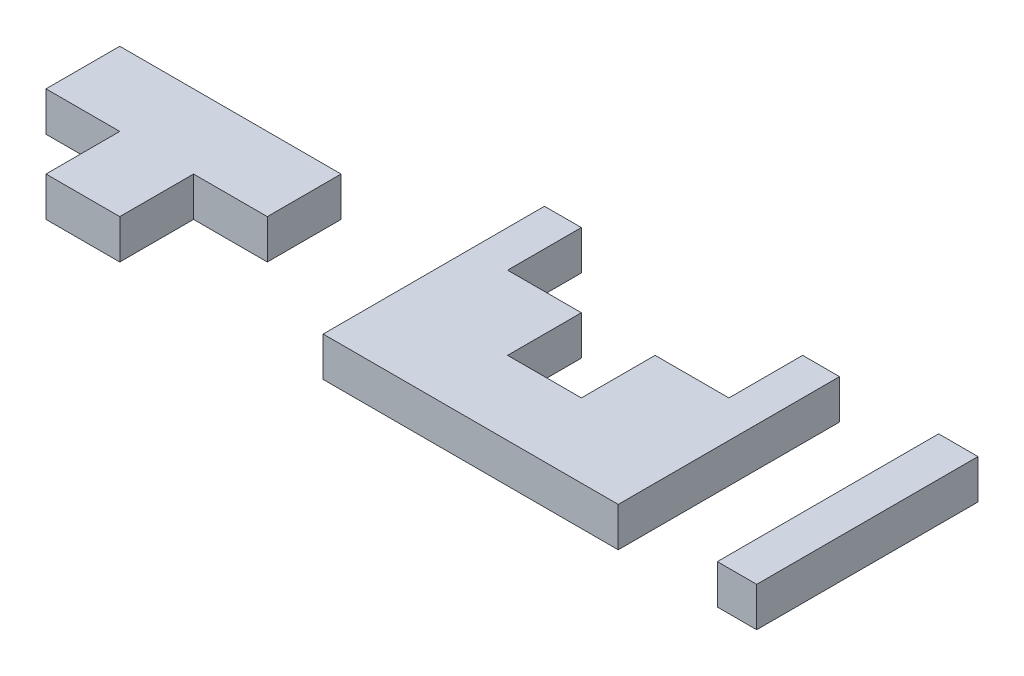
ISO-10303-21;
HEADER;
FILE_DESCRIPTION(('STEP AP214'),'2;1');
FILE_NAME('part.step','',(''),(''),'','','');
FILE_SCHEMA(('AUTOMOTIVE_DESIGN { 1 0 10303 214 1 1 1 1 }'));
ENDSEC;
DATA;
#1=APPLICATION_CONTEXT('core data for automotive mechanical design processes');
#2=APPLICATION_PROTOCOL_DEFINITION('international standard','automotive_design',2000,#1);
#3=PRODUCT_CONTEXT('',#1,'mechanical');
#4=PRODUCT('Part','Part','',(#3));
#5=PRODUCT_RELATED_PRODUCT_CATEGORY('part','',(#4));
#6=PRODUCT_DEFINITION_FORMATION('','',#4);
#7=PRODUCT_DEFINITION_CONTEXT('part definition',#1,'design');
#8=PRODUCT_DEFINITION('design','',#6,#7);
#9=PRODUCT_DEFINITION_SHAPE('','',#8);
#10=(LENGTH_UNIT() NAMED_UNIT(*) SI_UNIT(.MILLI.,.METRE.));
#11=(NAMED_UNIT(*) PLANE_ANGLE_UNIT() SI_UNIT($,.RADIAN.));
#12=(NAMED_UNIT(*) SI_UNIT($,.STERADIAN.) SOLID_ANGLE_UNIT());
#13=UNCERTAINTY_MEASURE_WITH_UNIT(LENGTH_MEASURE(1.E-05),#10,'distance_accuracy_value','');
#14=(GEOMETRIC_REPRESENTATION_CONTEXT(3) GLOBAL_UNCERTAINTY_ASSIGNED_CONTEXT((#13)) GLOBAL_UNIT_ASSIGNED_CONTEXT((#10,
#11,#12)) REPRESENTATION_CONTEXT('',''));
#15=CARTESIAN_POINT('',(0.,0.,0.));
#16=DIRECTION('',(0.,0.,1.));
#17=DIRECTION('',(1.,0.,0.));
#18=AXIS2_PLACEMENT_3D('',#15,#16,#17);
#19=CARTESIAN_POINT('',(105.177341044386,8.,-45.));
#20=DIRECTION('',(1.,0.,0.));
#21=DIRECTION('',(0.,0.,-1.));
#22=AXIS2_PLACEMENT_3D('',#19,#20,#21);
#23=PLANE('',#22);
#24=DIRECTION('',(0.,0.,1.));
#25=VECTOR('',#24,1.);
#26=CARTESIAN_POINT('',(105.177341044386,0.,-45.));
#27=LINE('',#26,#25);
#28=CARTESIAN_POINT('',(105.177341044386,0.,-45.));
#29=VERTEX_POINT('',#28);
#30=CARTESIAN_POINT('',(105.177341044386,0.,0.));
#31=VERTEX_POINT('',#30);
#32=EDGE_CURVE('E113',#29,#31,#27,.T.);
#33=ORIENTED_EDGE('',*,*,#32,.T.);
#34=DIRECTION('',(0.,-1.,0.));
#35=VECTOR('',#34,1.);
#36=CARTESIAN_POINT('',(105.177341044386,8.,0.));
#37=LINE('',#36,#35);
#38=CARTESIAN_POINT('',(105.177341044386,8.,0.));
#39=VERTEX_POINT('',#38);
#40=EDGE_CURVE('E12',#39,#31,#37,.T.);
#41=ORIENTED_EDGE('',*,*,#40,.F.);
#42=DIRECTION('',(0.,0.,1.));
#43=VECTOR('',#42,1.);
#44=CARTESIAN_POINT('',(105.177341044386,8.,-45.));
#45=LINE('',#44,#43);
#46=CARTESIAN_POINT('',(105.177341044386,8.,-45.));
#47=VERTEX_POINT('',#46);
#48=EDGE_CURVE('E101',#47,#39,#45,.T.);
#49=ORIENTED_EDGE('',*,*,#48,.F.);
#50=DIRECTION('',(0.,-1.,0.));
#51=VECTOR('',#50,1.);
#52=CARTESIAN_POINT('',(105.177341044386,8.,-45.));
#53=LINE('',#52,#51);
#54=EDGE_CURVE('E109',#47,#29,#53,.T.);
#55=ORIENTED_EDGE('',*,*,#54,.T.);
#56=EDGE_LOOP('',(#33,#41,#49,#55));
#57=FACE_BOUND('',#56,.T.);
#58=ADVANCED_FACE('F50',(#57),#23,.F.);
#59=CARTESIAN_POINT('',(105.177341044386,8.,0.));
#60=DIRECTION('',(0.,0.,-1.));
#61=DIRECTION('',(-1.,0.,0.));
#62=AXIS2_PLACEMENT_3D('',#59,#60,#61);
#63=PLANE('',#62);
#64=DIRECTION('',(1.,0.,0.));
#65=VECTOR('',#64,1.);
#66=CARTESIAN_POINT('',(105.177341044386,0.,0.));
#67=LINE('',#66,#65);
#68=CARTESIAN_POINT('',(113.177341044386,0.,0.));
#69=VERTEX_POINT('',#68);
#70=EDGE_CURVE('E105',#31,#69,#67,.T.);
#71=ORIENTED_EDGE('',*,*,#70,.T.);
#72=DIRECTION('',(0.,-1.,0.));
#73=VECTOR('',#72,1.);
#74=CARTESIAN_POINT('',(113.177341044386,8.,0.));
#75=LINE('',#74,#73);
#76=CARTESIAN_POINT('',(113.177341044386,8.,0.));
#77=VERTEX_POINT('',#76);
#78=EDGE_CURVE('E58',#77,#69,#75,.T.);
#79=ORIENTED_EDGE('',*,*,#78,.F.);
#80=DIRECTION('',(1.,0.,0.));
#81=VECTOR('',#80,1.);
#82=CARTESIAN_POINT('',(105.177341044386,8.,0.));
#83=LINE('',#82,#81);
#84=EDGE_CURVE('E96',#39,#77,#83,.T.);
#85=ORIENTED_EDGE('',*,*,#84,.F.);
#86=ORIENTED_EDGE('',*,*,#40,.T.);
#87=EDGE_LOOP('',(#71,#79,#85,#86));
#88=FACE_BOUND('',#87,.T.);
#89=ADVANCED_FACE('F104',(#88),#63,.F.);
#90=CARTESIAN_POINT('',(113.177341044386,8.,-45.));
#91=DIRECTION('',(-1.,0.,0.));
#92=DIRECTION('',(0.,0.,1.));
#93=AXIS2_PLACEMENT_3D('',#90,#91,#92);
#94=PLANE('',#93);
#95=DIRECTION('',(0.,0.,-1.));
#96=VECTOR('',#95,1.);
#97=CARTESIAN_POINT('',(113.177341044386,0.,-45.));
#98=LINE('',#97,#96);
#99=CARTESIAN_POINT('',(113.177341044386,0.,-45.));
#100=VERTEX_POINT('',#99);
#101=EDGE_CURVE('E83',#69,#100,#98,.T.);
#102=ORIENTED_EDGE('',*,*,#101,.T.);
#103=DIRECTION('',(0.,-1.,0.));
#104=VECTOR('',#103,1.);
#105=CARTESIAN_POINT('',(113.177341044386,8.,-45.));
#106=LINE('',#105,#104);
#107=CARTESIAN_POINT('',(113.177341044386,8.,-45.));
#108=VERTEX_POINT('',#107);
#109=EDGE_CURVE('E106',#108,#100,#106,.T.);
#110=ORIENTED_EDGE('',*,*,#109,.F.);
#111=DIRECTION('',(0.,0.,-1.));
#112=VECTOR('',#111,1.);
#113=CARTESIAN_POINT('',(113.177341044386,8.,-45.));
#114=LINE('',#113,#112);
#115=EDGE_CURVE('E99',#77,#108,#114,.T.);
#116=ORIENTED_EDGE('',*,*,#115,.F.);
#117=ORIENTED_EDGE('',*,*,#78,.T.);
#118=EDGE_LOOP('',(#102,#110,#116,#117));
#119=FACE_BOUND('',#118,.T.);
#120=ADVANCED_FACE('F107',(#119),#94,.F.);
#121=CARTESIAN_POINT('',(105.177341044386,8.,-45.));
#122=DIRECTION('',(0.,0.,1.));
#123=DIRECTION('',(1.,0.,0.));
#124=AXIS2_PLACEMENT_3D('',#121,#122,#123);
#125=PLANE('',#124);
#126=DIRECTION('',(-1.,0.,0.));
#127=VECTOR('',#126,1.);
#128=CARTESIAN_POINT('',(105.177341044386,0.,-45.));
#129=LINE('',#128,#127);
#130=EDGE_CURVE('E89',#100,#29,#129,.T.);
#131=ORIENTED_EDGE('',*,*,#130,.T.);
#132=ORIENTED_EDGE('',*,*,#54,.F.);
#133=DIRECTION('',(-1.,0.,0.));
#134=VECTOR('',#133,1.);
#135=CARTESIAN_POINT('',(105.177341044386,8.,-45.));
#136=LINE('',#135,#134);
#137=EDGE_CURVE('E66',#108,#47,#136,.T.);
#138=ORIENTED_EDGE('',*,*,#137,.F.);
#139=ORIENTED_EDGE('',*,*,#109,.T.);
#140=EDGE_LOOP('',(#131,#132,#138,#139));
#141=FACE_BOUND('',#140,.T.);
#142=ADVANCED_FACE('F120',(#141),#125,.F.);
#143=CARTESIAN_POINT('',(0.,8.,0.));
#144=DIRECTION('',(0.,1.,0.));
#145=DIRECTION('',(0.,0.,1.));
#146=AXIS2_PLACEMENT_3D('',#143,#144,#145);
#147=PLANE('',#146);
#148=ORIENTED_EDGE('',*,*,#48,.T.);
#149=ORIENTED_EDGE('',*,*,#84,.T.);
#150=ORIENTED_EDGE('',*,*,#115,.T.);
#151=ORIENTED_EDGE('',*,*,#137,.T.);
#152=EDGE_LOOP('',(#148,#149,#150,#151));
#153=FACE_BOUND('',#152,.T.);
#154=ADVANCED_FACE('F97',(#153),#147,.T.);
#155=CARTESIAN_POINT('',(0.,0.,0.));
#156=DIRECTION('',(0.,1.,0.));
#157=DIRECTION('',(0.,0.,1.));
#158=AXIS2_PLACEMENT_3D('',#155,#156,#157);
#159=PLANE('',#158);
#160=ORIENTED_EDGE('',*,*,#32,.F.);
#161=ORIENTED_EDGE('',*,*,#130,.F.);
#162=ORIENTED_EDGE('',*,*,#101,.F.);
#163=ORIENTED_EDGE('',*,*,#70,.F.);
#164=EDGE_LOOP('',(#160,#161,#162,#163));
#165=FACE_BOUND('',#164,.T.);
#166=ADVANCED_FACE('F123',(#165),#159,.F.);
#167=CLOSED_SHELL('',(#58,#89,#120,#142,#154,#166));
#168=MANIFOLD_SOLID_BREP('B2',#167);
#169=CARTESIAN_POINT('',(32.5261096605744,8.,-45.));
#170=DIRECTION('',(0.,0.,1.));
#171=DIRECTION('',(1.,0.,0.));
#172=AXIS2_PLACEMENT_3D('',#169,#170,#171);
#173=PLANE('',#172);
#174=DIRECTION('',(-1.,0.,0.));
#175=VECTOR('',#174,1.);
#176=CARTESIAN_POINT('',(32.5261096605744,0.,-45.));
#177=LINE('',#176,#175);
#178=CARTESIAN_POINT('',(32.5261096605744,0.,-45.));
#179=VERTEX_POINT('',#178);
#180=CARTESIAN_POINT('',(25.0261096605744,0.,-45.));
#181=VERTEX_POINT('',#180);
#182=EDGE_CURVE('E308',#179,#181,#177,.T.);
#183=ORIENTED_EDGE('',*,*,#182,.T.);
#184=DIRECTION('',(0.,-1.,0.));
#185=VECTOR('',#184,1.);
#186=CARTESIAN_POINT('',(25.0261096605744,8.,-45.));
#187=LINE('',#186,#185);
#188=CARTESIAN_POINT('',(25.0261096605744,8.,-45.));
#189=VERTEX_POINT('',#188);
#190=EDGE_CURVE('E48',#189,#181,#187,.T.);
#191=ORIENTED_EDGE('',*,*,#190,.F.);
#192=DIRECTION('',(-1.,0.,0.));
#193=VECTOR('',#192,1.);
#194=CARTESIAN_POINT('',(32.5261096605744,8.,-45.));
#195=LINE('',#194,#193);
#196=CARTESIAN_POINT('',(32.5261096605744,8.,-45.));
#197=VERTEX_POINT('',#196);
#198=EDGE_CURVE('E342',#197,#189,#195,.T.);
#199=ORIENTED_EDGE('',*,*,#198,.F.);
#200=DIRECTION('',(0.,-1.,0.));
#201=VECTOR('',#200,1.);
#202=CARTESIAN_POINT('',(32.5261096605744,8.,-45.));
#203=LINE('',#202,#201);
#204=EDGE_CURVE('E304',#197,#179,#203,.T.);
#205=ORIENTED_EDGE('',*,*,#204,.T.);
#206=EDGE_LOOP('',(#183,#191,#199,#205));
#207=FACE_BOUND('',#206,.T.);
#208=ADVANCED_FACE('F183',(#207),#173,.F.);
#209=CARTESIAN_POINT('',(25.0261096605744,8.,-45.));
#210=DIRECTION('',(1.,0.,0.));
#211=DIRECTION('',(0.,0.,-1.));
#212=AXIS2_PLACEMENT_3D('',#209,#210,#211);
#213=PLANE('',#212);
#214=DIRECTION('',(0.,0.,1.));
#215=VECTOR('',#214,1.);
#216=CARTESIAN_POINT('',(25.0261096605744,0.,-45.));
#217=LINE('',#216,#215);
#218=CARTESIAN_POINT('',(25.0261096605744,0.,0.));
#219=VERTEX_POINT('',#218);
#220=EDGE_CURVE('E312',#181,#219,#217,.T.);
#221=ORIENTED_EDGE('',*,*,#220,.T.);
#222=DIRECTION('',(0.,-1.,0.));
#223=VECTOR('',#222,1.);
#224=CARTESIAN_POINT('',(25.0261096605744,8.,0.));
#225=LINE('',#224,#223);
#226=CARTESIAN_POINT('',(25.0261096605744,8.,0.));
#227=VERTEX_POINT('',#226);
#228=EDGE_CURVE('E192',#227,#219,#225,.T.);
#229=ORIENTED_EDGE('',*,*,#228,.F.);
#230=DIRECTION('',(0.,0.,1.));
#231=VECTOR('',#230,1.);
#232=CARTESIAN_POINT('',(25.0261096605744,8.,-45.));
#233=LINE('',#232,#231);
#234=EDGE_CURVE('E255',#189,#227,#233,.T.);
#235=ORIENTED_EDGE('',*,*,#234,.F.);
#236=ORIENTED_EDGE('',*,*,#190,.T.);
#237=EDGE_LOOP('',(#221,#229,#235,#236));
#238=FACE_BOUND('',#237,.T.);
#239=ADVANCED_FACE('F436',(#238),#213,.F.);
#240=CARTESIAN_POINT('',(25.0261096605744,8.,0.));
#241=DIRECTION('',(0.,0.,-1.));
#242=DIRECTION('',(-1.,0.,0.));
#243=AXIS2_PLACEMENT_3D('',#240,#241,#242);
#244=PLANE('',#243);
#245=DIRECTION('',(1.,0.,0.));
#246=VECTOR('',#245,1.);
#247=CARTESIAN_POINT('',(25.0261096605744,0.,0.));
#248=LINE('',#247,#246);
#249=CARTESIAN_POINT('',(85.0261096605744,0.,0.));
#250=VERTEX_POINT('',#249);
#251=EDGE_CURVE('E315',#219,#250,#248,.T.);
#252=ORIENTED_EDGE('',*,*,#251,.T.);
#253=DIRECTION('',(0.,-1.,0.));
#254=VECTOR('',#253,1.);
#255=CARTESIAN_POINT('',(85.0261096605744,8.,0.));
#256=LINE('',#255,#254);
#257=CARTESIAN_POINT('',(85.0261096605744,8.,0.));
#258=VERTEX_POINT('',#257);
#259=EDGE_CURVE('E369',#258,#250,#256,.T.);
#260=ORIENTED_EDGE('',*,*,#259,.F.);
#261=DIRECTION('',(1.,0.,0.));
#262=VECTOR('',#261,1.);
#263=CARTESIAN_POINT('',(25.0261096605744,8.,0.));
#264=LINE('',#263,#262);
#265=EDGE_CURVE('E379',#227,#258,#264,.T.);
#266=ORIENTED_EDGE('',*,*,#265,.F.);
#267=ORIENTED_EDGE('',*,*,#228,.T.);
#268=EDGE_LOOP('',(#252,#260,#266,#267));
#269=FACE_BOUND('',#268,.T.);
#270=ADVANCED_FACE('F377',(#269),#244,.F.);
#271=CARTESIAN_POINT('',(85.0261096605744,8.,0.));
#272=DIRECTION('',(-1.,0.,0.));
#273=DIRECTION('',(0.,0.,1.));
#274=AXIS2_PLACEMENT_3D('',#271,#272,#273);
#275=PLANE('',#274);
#276=DIRECTION('',(0.,0.,-1.));
#277=VECTOR('',#276,1.);
#278=CARTESIAN_POINT('',(85.0261096605744,0.,0.));
#279=LINE('',#278,#277);
#280=CARTESIAN_POINT('',(85.0261096605744,0.,-45.));
#281=VERTEX_POINT('',#280);
#282=EDGE_CURVE('E318',#250,#281,#279,.T.);
#283=ORIENTED_EDGE('',*,*,#282,.T.);
#284=DIRECTION('',(0.,-1.,0.));
#285=VECTOR('',#284,1.);
#286=CARTESIAN_POINT('',(85.0261096605744,8.,-45.));
#287=LINE('',#286,#285);
#288=CARTESIAN_POINT('',(85.0261096605744,8.,-45.));
#289=VERTEX_POINT('',#288);
#290=EDGE_CURVE('E365',#289,#281,#287,.T.);
#291=ORIENTED_EDGE('',*,*,#290,.F.);
#292=DIRECTION('',(0.,0.,-1.));
#293=VECTOR('',#292,1.);
#294=CARTESIAN_POINT('',(85.0261096605744,8.,0.));
#295=LINE('',#294,#293);
#296=EDGE_CURVE('E398',#258,#289,#295,.T.);
#297=ORIENTED_EDGE('',*,*,#296,.F.);
#298=ORIENTED_EDGE('',*,*,#259,.T.);
#299=EDGE_LOOP('',(#283,#291,#297,#298));
#300=FACE_BOUND('',#299,.T.);
#301=ADVANCED_FACE('F388',(#300),#275,.F.);
#302=CARTESIAN_POINT('',(85.0261096605744,8.,-45.));
#303=DIRECTION('',(0.,0.,1.));
#304=DIRECTION('',(1.,0.,0.));
#305=AXIS2_PLACEMENT_3D('',#302,#303,#304);
#306=PLANE('',#305);
#307=DIRECTION('',(-1.,0.,0.));
#308=VECTOR('',#307,1.);
#309=CARTESIAN_POINT('',(85.0261096605744,0.,-45.));
#310=LINE('',#309,#308);
#311=CARTESIAN_POINT('',(77.5261096605744,0.,-45.));
#312=VERTEX_POINT('',#311);
#313=EDGE_CURVE('E321',#281,#312,#310,.T.);
#314=ORIENTED_EDGE('',*,*,#313,.T.);
#315=DIRECTION('',(0.,-1.,0.));
#316=VECTOR('',#315,1.);
#317=CARTESIAN_POINT('',(77.5261096605744,8.,-45.));
#318=LINE('',#317,#316);
#319=CARTESIAN_POINT('',(77.5261096605744,8.,-45.));
#320=VERTEX_POINT('',#319);
#321=EDGE_CURVE('E361',#320,#312,#318,.T.);
#322=ORIENTED_EDGE('',*,*,#321,.F.);
#323=DIRECTION('',(-1.,0.,0.));
#324=VECTOR('',#323,1.);
#325=CARTESIAN_POINT('',(85.0261096605744,8.,-45.));
#326=LINE('',#325,#324);
#327=EDGE_CURVE('E394',#289,#320,#326,.T.);
#328=ORIENTED_EDGE('',*,*,#327,.F.);
#329=ORIENTED_EDGE('',*,*,#290,.T.);
#330=EDGE_LOOP('',(#314,#322,#328,#329));
#331=FACE_BOUND('',#330,.T.);
#332=ADVANCED_FACE('F392',(#331),#306,.F.);
#333=CARTESIAN_POINT('',(77.5261096605744,8.,-45.));
#334=DIRECTION('',(1.,0.,0.));
#335=DIRECTION('',(0.,0.,-1.));
#336=AXIS2_PLACEMENT_3D('',#333,#334,#335);
#337=PLANE('',#336);
#338=DIRECTION('',(0.,0.,1.));
#339=VECTOR('',#338,1.);
#340=CARTESIAN_POINT('',(77.5261096605744,0.,-45.));
#341=LINE('',#340,#339);
#342=CARTESIAN_POINT('',(77.5261096605744,0.,-30.));
#343=VERTEX_POINT('',#342);
#344=EDGE_CURVE('E324',#312,#343,#341,.T.);
#345=ORIENTED_EDGE('',*,*,#344,.T.);
#346=DIRECTION('',(0.,-1.,0.));
#347=VECTOR('',#346,1.);
#348=CARTESIAN_POINT('',(77.5261096605744,8.,-30.));
#349=LINE('',#348,#347);
#350=CARTESIAN_POINT('',(77.5261096605744,8.,-30.));
#351=VERTEX_POINT('',#350);
#352=EDGE_CURVE('E357',#351,#343,#349,.T.);
#353=ORIENTED_EDGE('',*,*,#352,.F.);
#354=DIRECTION('',(0.,0.,1.));
#355=VECTOR('',#354,1.);
#356=CARTESIAN_POINT('',(77.5261096605744,8.,-45.));
#357=LINE('',#356,#355);
#358=EDGE_CURVE('E397',#320,#351,#357,.T.);
#359=ORIENTED_EDGE('',*,*,#358,.F.);
#360=ORIENTED_EDGE('',*,*,#321,.T.);
#361=EDGE_LOOP('',(#345,#353,#359,#360));
#362=FACE_BOUND('',#361,.T.);
#363=ADVANCED_FACE('F449',(#362),#337,.F.);
#364=CARTESIAN_POINT('',(77.5261096605744,8.,-30.));
#365=DIRECTION('',(0.,0.,1.));
#366=DIRECTION('',(1.,0.,0.));
#367=AXIS2_PLACEMENT_3D('',#364,#365,#366);
#368=PLANE('',#367);
#369=DIRECTION('',(-1.,0.,0.));
#370=VECTOR('',#369,1.);
#371=CARTESIAN_POINT('',(77.5261096605744,0.,-30.));
#372=LINE('',#371,#370);
#373=CARTESIAN_POINT('',(62.5261096605744,0.,-30.));
#374=VERTEX_POINT('',#373);
#375=EDGE_CURVE('E327',#343,#374,#372,.T.);
#376=ORIENTED_EDGE('',*,*,#375,.T.);
#377=DIRECTION('',(0.,-1.,0.));
#378=VECTOR('',#377,1.);
#379=CARTESIAN_POINT('',(62.5261096605744,8.,-30.));
#380=LINE('',#379,#378);
#381=CARTESIAN_POINT('',(62.5261096605744,8.,-30.));
#382=VERTEX_POINT('',#381);
#383=EDGE_CURVE('E353',#382,#374,#380,.T.);
#384=ORIENTED_EDGE('',*,*,#383,.F.);
#385=DIRECTION('',(-1.,0.,0.));
#386=VECTOR('',#385,1.);
#387=CARTESIAN_POINT('',(77.5261096605744,8.,-30.));
#388=LINE('',#387,#386);
#389=EDGE_CURVE('E402',#351,#382,#388,.T.);
#390=ORIENTED_EDGE('',*,*,#389,.F.);
#391=ORIENTED_EDGE('',*,*,#352,.T.);
#392=EDGE_LOOP('',(#376,#384,#390,#391));
#393=FACE_BOUND('',#392,.T.);
#394=ADVANCED_FACE('F452',(#393),#368,.F.);
#395=CARTESIAN_POINT('',(62.5261096605744,8.,-30.));
#396=DIRECTION('',(1.,0.,0.));
#397=DIRECTION('',(0.,0.,-1.));
#398=AXIS2_PLACEMENT_3D('',#395,#396,#397);
#399=PLANE('',#398);
#400=DIRECTION('',(0.,0.,1.));
#401=VECTOR('',#400,1.);
#402=CARTESIAN_POINT('',(62.5261096605744,0.,-30.));
#403=LINE('',#402,#401);
#404=CARTESIAN_POINT('',(62.5261096605744,0.,-15.));
#405=VERTEX_POINT('',#404);
#406=EDGE_CURVE('E330',#374,#405,#403,.T.);
#407=ORIENTED_EDGE('',*,*,#406,.T.);
#408=DIRECTION('',(0.,-1.,0.));
#409=VECTOR('',#408,1.);
#410=CARTESIAN_POINT('',(62.5261096605744,8.,-15.));
#411=LINE('',#410,#409);
#412=CARTESIAN_POINT('',(62.5261096605744,8.,-15.));
#413=VERTEX_POINT('',#412);
#414=EDGE_CURVE('E349',#413,#405,#411,.T.);
#415=ORIENTED_EDGE('',*,*,#414,.F.);
#416=DIRECTION('',(0.,0.,1.));
#417=VECTOR('',#416,1.);
#418=CARTESIAN_POINT('',(62.5261096605744,8.,-30.));
#419=LINE('',#418,#417);
#420=EDGE_CURVE('E409',#382,#413,#419,.T.);
#421=ORIENTED_EDGE('',*,*,#420,.F.);
#422=ORIENTED_EDGE('',*,*,#383,.T.);
#423=EDGE_LOOP('',(#407,#415,#421,#422));
#424=FACE_BOUND('',#423,.T.);
#425=ADVANCED_FACE('F417',(#424),#399,.F.);
#426=CARTESIAN_POINT('',(62.5261096605744,8.,-15.));
#427=DIRECTION('',(0.,0.,1.));
#428=DIRECTION('',(1.,0.,0.));
#429=AXIS2_PLACEMENT_3D('',#426,#427,#428);
#430=PLANE('',#429);
#431=DIRECTION('',(-1.,0.,0.));
#432=VECTOR('',#431,1.);
#433=CARTESIAN_POINT('',(62.5261096605744,0.,-15.));
#434=LINE('',#433,#432);
#435=CARTESIAN_POINT('',(47.5261096605744,0.,-15.));
#436=VERTEX_POINT('',#435);
#437=EDGE_CURVE('E333',#405,#436,#434,.T.);
#438=ORIENTED_EDGE('',*,*,#437,.T.);
#439=DIRECTION('',(0.,-1.,0.));
#440=VECTOR('',#439,1.);
#441=CARTESIAN_POINT('',(47.5261096605744,8.,-15.));
#442=LINE('',#441,#440);
#443=CARTESIAN_POINT('',(47.5261096605744,8.,-15.));
#444=VERTEX_POINT('',#443);
#445=EDGE_CURVE('E297',#444,#436,#442,.T.);
#446=ORIENTED_EDGE('',*,*,#445,.F.);
#447=DIRECTION('',(-1.,0.,0.));
#448=VECTOR('',#447,1.);
#449=CARTESIAN_POINT('',(62.5261096605744,8.,-15.));
#450=LINE('',#449,#448);
#451=EDGE_CURVE('E286',#413,#444,#450,.T.);
#452=ORIENTED_EDGE('',*,*,#451,.F.);
#453=ORIENTED_EDGE('',*,*,#414,.T.);
#454=EDGE_LOOP('',(#438,#446,#452,#453));
#455=FACE_BOUND('',#454,.T.);
#456=ADVANCED_FACE('F421',(#455),#430,.F.);
#457=CARTESIAN_POINT('',(47.5261096605744,8.,-15.));
#458=DIRECTION('',(-1.,0.,0.));
#459=DIRECTION('',(0.,0.,1.));
#460=AXIS2_PLACEMENT_3D('',#457,#458,#459);
#461=PLANE('',#460);
#462=DIRECTION('',(0.,0.,-1.));
#463=VECTOR('',#462,1.);
#464=CARTESIAN_POINT('',(47.5261096605744,0.,-15.));
#465=LINE('',#464,#463);
#466=CARTESIAN_POINT('',(47.5261096605744,0.,-30.));
#467=VERTEX_POINT('',#466);
#468=EDGE_CURVE('E295',#436,#467,#465,.T.);
#469=ORIENTED_EDGE('',*,*,#468,.T.);
#470=DIRECTION('',(0.,-1.,0.));
#471=VECTOR('',#470,1.);
#472=CARTESIAN_POINT('',(47.5261096605744,8.,-30.));
#473=LINE('',#472,#471);
#474=CARTESIAN_POINT('',(47.5261096605744,8.,-30.));
#475=VERTEX_POINT('',#474);
#476=EDGE_CURVE('E292',#475,#467,#473,.T.);
#477=ORIENTED_EDGE('',*,*,#476,.F.);
#478=DIRECTION('',(0.,0.,-1.));
#479=VECTOR('',#478,1.);
#480=CARTESIAN_POINT('',(47.5261096605744,8.,-15.));
#481=LINE('',#480,#479);
#482=EDGE_CURVE('E280',#444,#475,#481,.T.);
#483=ORIENTED_EDGE('',*,*,#482,.F.);
#484=ORIENTED_EDGE('',*,*,#445,.T.);
#485=EDGE_LOOP('',(#469,#477,#483,#484));
#486=FACE_BOUND('',#485,.T.);
#487=ADVANCED_FACE('F293',(#486),#461,.F.);
#488=CARTESIAN_POINT('',(47.5261096605744,8.,-30.));
#489=DIRECTION('',(0.,0.,1.));
#490=DIRECTION('',(1.,0.,0.));
#491=AXIS2_PLACEMENT_3D('',#488,#489,#490);
#492=PLANE('',#491);
#493=DIRECTION('',(-1.,0.,0.));
#494=VECTOR('',#493,1.);
#495=CARTESIAN_POINT('',(47.5261096605744,0.,-30.));
#496=LINE('',#495,#494);
#497=CARTESIAN_POINT('',(32.5261096605744,0.,-30.));
#498=VERTEX_POINT('',#497);
#499=EDGE_CURVE('E241',#467,#498,#496,.T.);
#500=ORIENTED_EDGE('',*,*,#499,.T.);
#501=DIRECTION('',(0.,-1.,0.));
#502=VECTOR('',#501,1.);
#503=CARTESIAN_POINT('',(32.5261096605744,8.,-30.));
#504=LINE('',#503,#502);
#505=CARTESIAN_POINT('',(32.5261096605744,8.,-30.));
#506=VERTEX_POINT('',#505);
#507=EDGE_CURVE('E298',#506,#498,#504,.T.);
#508=ORIENTED_EDGE('',*,*,#507,.F.);
#509=DIRECTION('',(-1.,0.,0.));
#510=VECTOR('',#509,1.);
#511=CARTESIAN_POINT('',(47.5261096605744,8.,-30.));
#512=LINE('',#511,#510);
#513=EDGE_CURVE('E284',#475,#506,#512,.T.);
#514=ORIENTED_EDGE('',*,*,#513,.F.);
#515=ORIENTED_EDGE('',*,*,#476,.T.);
#516=EDGE_LOOP('',(#500,#508,#514,#515));
#517=FACE_BOUND('',#516,.T.);
#518=ADVANCED_FACE('F300',(#517),#492,.F.);
#519=CARTESIAN_POINT('',(32.5261096605744,8.,-30.));
#520=DIRECTION('',(-1.,0.,0.));
#521=DIRECTION('',(0.,0.,1.));
#522=AXIS2_PLACEMENT_3D('',#519,#520,#521);
#523=PLANE('',#522);
#524=DIRECTION('',(0.,0.,-1.));
#525=VECTOR('',#524,1.);
#526=CARTESIAN_POINT('',(32.5261096605744,0.,-30.));
#527=LINE('',#526,#525);
#528=EDGE_CURVE('E247',#498,#179,#527,.T.);
#529=ORIENTED_EDGE('',*,*,#528,.T.);
#530=ORIENTED_EDGE('',*,*,#204,.F.);
#531=DIRECTION('',(0.,0.,-1.));
#532=VECTOR('',#531,1.);
#533=CARTESIAN_POINT('',(32.5261096605744,8.,-30.));
#534=LINE('',#533,#532);
#535=EDGE_CURVE('E200',#506,#197,#534,.T.);
#536=ORIENTED_EDGE('',*,*,#535,.F.);
#537=ORIENTED_EDGE('',*,*,#507,.T.);
#538=EDGE_LOOP('',(#529,#530,#536,#537));
#539=FACE_BOUND('',#538,.T.);
#540=ADVANCED_FACE('F425',(#539),#523,.F.);
#541=CARTESIAN_POINT('',(0.,8.,0.));
#542=DIRECTION('',(0.,1.,0.));
#543=DIRECTION('',(0.,0.,1.));
#544=AXIS2_PLACEMENT_3D('',#541,#542,#543);
#545=PLANE('',#544);
#546=ORIENTED_EDGE('',*,*,#198,.T.);
#547=ORIENTED_EDGE('',*,*,#234,.T.);
#548=ORIENTED_EDGE('',*,*,#265,.T.);
#549=ORIENTED_EDGE('',*,*,#296,.T.);
#550=ORIENTED_EDGE('',*,*,#327,.T.);
#551=ORIENTED_EDGE('',*,*,#358,.T.);
#552=ORIENTED_EDGE('',*,*,#389,.T.);
#553=ORIENTED_EDGE('',*,*,#420,.T.);
#554=ORIENTED_EDGE('',*,*,#451,.T.);
#555=ORIENTED_EDGE('',*,*,#482,.T.);
#556=ORIENTED_EDGE('',*,*,#513,.T.);
#557=ORIENTED_EDGE('',*,*,#535,.T.);
#558=EDGE_LOOP('',(#546,#547,#548,#549,#550,#551,#552,#553,#554,#555,#556,#557));
#559=FACE_BOUND('',#558,.T.);
#560=ADVANCED_FACE('F282',(#559),#545,.T.);
#561=CARTESIAN_POINT('',(0.,0.,0.));
#562=DIRECTION('',(0.,1.,0.));
#563=DIRECTION('',(0.,0.,1.));
#564=AXIS2_PLACEMENT_3D('',#561,#562,#563);
#565=PLANE('',#564);
#566=ORIENTED_EDGE('',*,*,#182,.F.);
#567=ORIENTED_EDGE('',*,*,#528,.F.);
#568=ORIENTED_EDGE('',*,*,#499,.F.);
#569=ORIENTED_EDGE('',*,*,#468,.F.);
#570=ORIENTED_EDGE('',*,*,#437,.F.);
#571=ORIENTED_EDGE('',*,*,#406,.F.);
#572=ORIENTED_EDGE('',*,*,#375,.F.);
#573=ORIENTED_EDGE('',*,*,#344,.F.);
#574=ORIENTED_EDGE('',*,*,#313,.F.);
#575=ORIENTED_EDGE('',*,*,#282,.F.);
#576=ORIENTED_EDGE('',*,*,#251,.F.);
#577=ORIENTED_EDGE('',*,*,#220,.F.);
#578=EDGE_LOOP('',(#566,#567,#568,#569,#570,#571,#572,#573,#574,#575,#576,#577));
#579=FACE_BOUND('',#578,.T.);
#580=ADVANCED_FACE('F383',(#579),#565,.F.);
#581=CLOSED_SHELL('',(#208,#239,#270,#301,#332,#363,#394,#425,#456,#487,#518,#540,#560,#580));
#582=MANIFOLD_SOLID_BREP('B6',#581);
#583=CARTESIAN_POINT('',(-31.331592689295,8.,-15.));
#584=DIRECTION('',(1.,0.,0.));
#585=DIRECTION('',(0.,0.,-1.));
#586=AXIS2_PLACEMENT_3D('',#583,#584,#585);
#587=PLANE('',#586);
#588=DIRECTION('',(0.,0.,1.));
#589=VECTOR('',#588,1.);
#590=CARTESIAN_POINT('',(-31.331592689295,0.,-15.));
#591=LINE('',#590,#589);
#592=CARTESIAN_POINT('',(-31.331592689295,0.,-15.));
#593=VERTEX_POINT('',#592);
#594=CARTESIAN_POINT('',(-31.331592689295,0.,0.));
#595=VERTEX_POINT('',#594);
#596=EDGE_CURVE('E647',#593,#595,#591,.T.);
#597=ORIENTED_EDGE('',*,*,#596,.T.);
#598=DIRECTION('',(0.,-1.,0.));
#599=VECTOR('',#598,1.);
#600=CARTESIAN_POINT('',(-31.331592689295,8.,0.));
#601=LINE('',#600,#599);
#602=CARTESIAN_POINT('',(-31.331592689295,8.,0.));
#603=VERTEX_POINT('',#602);
#604=EDGE_CURVE('E181',#603,#595,#601,.T.);
#605=ORIENTED_EDGE('',*,*,#604,.F.);
#606=DIRECTION('',(0.,0.,1.));
#607=VECTOR('',#606,1.);
#608=CARTESIAN_POINT('',(-31.331592689295,8.,-15.));
#609=LINE('',#608,#607);
#610=CARTESIAN_POINT('',(-31.331592689295,8.,-15.));
#611=VERTEX_POINT('',#610);
#612=EDGE_CURVE('E661',#611,#603,#609,.T.);
#613=ORIENTED_EDGE('',*,*,#612,.F.);
#614=DIRECTION('',(0.,-1.,0.));
#615=VECTOR('',#614,1.);
#616=CARTESIAN_POINT('',(-31.331592689295,8.,-15.));
#617=LINE('',#616,#615);
#618=EDGE_CURVE('E643',#611,#593,#617,.T.);
#619=ORIENTED_EDGE('',*,*,#618,.T.);
#620=EDGE_LOOP('',(#597,#605,#613,#619));
#621=FACE_BOUND('',#620,.T.);
#622=ADVANCED_FACE('F551',(#621),#587,.F.);
#623=CARTESIAN_POINT('',(-31.331592689295,8.,0.));
#624=DIRECTION('',(0.,0.,-1.));
#625=DIRECTION('',(-1.,0.,0.));
#626=AXIS2_PLACEMENT_3D('',#623,#624,#625);
#627=PLANE('',#626);
#628=DIRECTION('',(1.,0.,0.));
#629=VECTOR('',#628,1.);
#630=CARTESIAN_POINT('',(-31.331592689295,0.,0.));
#631=LINE('',#630,#629);
#632=CARTESIAN_POINT('',(-16.331592689295,0.,0.));
#633=VERTEX_POINT('',#632);
#634=EDGE_CURVE('E650',#595,#633,#631,.T.);
#635=ORIENTED_EDGE('',*,*,#634,.T.);
#636=DIRECTION('',(0.,-1.,0.));
#637=VECTOR('',#636,1.);
#638=CARTESIAN_POINT('',(-16.331592689295,8.,0.));
#639=LINE('',#638,#637);
#640=CARTESIAN_POINT('',(-16.331592689295,8.,0.));
#641=VERTEX_POINT('',#640);
#642=EDGE_CURVE('E559',#641,#633,#639,.T.);
#643=ORIENTED_EDGE('',*,*,#642,.F.);
#644=DIRECTION('',(1.,0.,0.));
#645=VECTOR('',#644,1.);
#646=CARTESIAN_POINT('',(-31.331592689295,8.,0.));
#647=LINE('',#646,#645);
#648=EDGE_CURVE('E610',#603,#641,#647,.T.);
#649=ORIENTED_EDGE('',*,*,#648,.F.);
#650=ORIENTED_EDGE('',*,*,#604,.T.);
#651=EDGE_LOOP('',(#635,#643,#649,#650));
#652=FACE_BOUND('',#651,.T.);
#653=ADVANCED_FACE('F696',(#652),#627,.F.);
#654=CARTESIAN_POINT('',(-16.331592689295,8.,0.));
#655=DIRECTION('',(-1.,0.,0.));
#656=DIRECTION('',(0.,0.,1.));
#657=AXIS2_PLACEMENT_3D('',#654,#655,#656);
#658=PLANE('',#657);
#659=DIRECTION('',(0.,0.,-1.));
#660=VECTOR('',#659,1.);
#661=CARTESIAN_POINT('',(-16.331592689295,0.,0.));
#662=LINE('',#661,#660);
#663=CARTESIAN_POINT('',(-16.331592689295,0.,-15.));
#664=VERTEX_POINT('',#663);
#665=EDGE_CURVE('E652',#633,#664,#662,.T.);
#666=ORIENTED_EDGE('',*,*,#665,.T.);
#667=DIRECTION('',(0.,-1.,0.));
#668=VECTOR('',#667,1.);
#669=CARTESIAN_POINT('',(-16.331592689295,8.,-15.));
#670=LINE('',#669,#668);
#671=CARTESIAN_POINT('',(-16.331592689295,8.,-15.));
#672=VERTEX_POINT('',#671);
#673=EDGE_CURVE('E668',#672,#664,#670,.T.);
#674=ORIENTED_EDGE('',*,*,#673,.F.);
#675=DIRECTION('',(0.,0.,-1.));
#676=VECTOR('',#675,1.);
#677=CARTESIAN_POINT('',(-16.331592689295,8.,0.));
#678=LINE('',#677,#676);
#679=EDGE_CURVE('E676',#641,#672,#678,.T.);
#680=ORIENTED_EDGE('',*,*,#679,.F.);
#681=ORIENTED_EDGE('',*,*,#642,.T.);
#682=EDGE_LOOP('',(#666,#674,#680,#681));
#683=FACE_BOUND('',#682,.T.);
#684=ADVANCED_FACE('F674',(#683),#658,.F.);
#685=CARTESIAN_POINT('',(-16.331592689295,8.,-15.));
#686=DIRECTION('',(0.,0.,-1.));
#687=DIRECTION('',(-1.,0.,0.));
#688=AXIS2_PLACEMENT_3D('',#685,#686,#687);
#689=PLANE('',#688);
#690=DIRECTION('',(1.,0.,0.));
#691=VECTOR('',#690,1.);
#692=CARTESIAN_POINT('',(-16.331592689295,0.,-15.));
#693=LINE('',#692,#691);
#694=CARTESIAN_POINT('',(-1.33159268929504,0.,-15.));
#695=VERTEX_POINT('',#694);
#696=EDGE_CURVE('E654',#664,#695,#693,.T.);
#697=ORIENTED_EDGE('',*,*,#696,.T.);
#698=DIRECTION('',(0.,-1.,0.));
#699=VECTOR('',#698,1.);
#700=CARTESIAN_POINT('',(-1.33159268929504,8.,-15.));
#701=LINE('',#700,#699);
#702=CARTESIAN_POINT('',(-1.33159268929504,8.,-15.));
#703=VERTEX_POINT('',#702);
#704=EDGE_CURVE('E665',#703,#695,#701,.T.);
#705=ORIENTED_EDGE('',*,*,#704,.F.);
#706=DIRECTION('',(1.,0.,0.));
#707=VECTOR('',#706,1.);
#708=CARTESIAN_POINT('',(-16.331592689295,8.,-15.));
#709=LINE('',#708,#707);
#710=EDGE_CURVE('E688',#672,#703,#709,.T.);
#711=ORIENTED_EDGE('',*,*,#710,.F.);
#712=ORIENTED_EDGE('',*,*,#673,.T.);
#713=EDGE_LOOP('',(#697,#705,#711,#712));
#714=FACE_BOUND('',#713,.T.);
#715=ADVANCED_FACE('F684',(#714),#689,.F.);
#716=CARTESIAN_POINT('',(-1.33159268929504,8.,-15.));
#717=DIRECTION('',(-1.,0.,0.));
#718=DIRECTION('',(0.,0.,1.));
#719=AXIS2_PLACEMENT_3D('',#716,#717,#718);
#720=PLANE('',#719);
#721=DIRECTION('',(0.,0.,-1.));
#722=VECTOR('',#721,1.);
#723=CARTESIAN_POINT('',(-1.33159268929504,0.,-15.));
#724=LINE('',#723,#722);
#725=CARTESIAN_POINT('',(-1.33159268929504,0.,-30.));
#726=VERTEX_POINT('',#725);
#727=EDGE_CURVE('E656',#695,#726,#724,.T.);
#728=ORIENTED_EDGE('',*,*,#727,.T.);
#729=DIRECTION('',(0.,-1.,0.));
#730=VECTOR('',#729,1.);
#731=CARTESIAN_POINT('',(-1.33159268929504,8.,-30.));
#732=LINE('',#731,#730);
#733=CARTESIAN_POINT('',(-1.33159268929504,8.,-30.));
#734=VERTEX_POINT('',#733);
#735=EDGE_CURVE('E638',#734,#726,#732,.T.);
#736=ORIENTED_EDGE('',*,*,#735,.F.);
#737=DIRECTION('',(0.,0.,-1.));
#738=VECTOR('',#737,1.);
#739=CARTESIAN_POINT('',(-1.33159268929504,8.,-15.));
#740=LINE('',#739,#738);
#741=EDGE_CURVE('E629',#703,#734,#740,.T.);
#742=ORIENTED_EDGE('',*,*,#741,.F.);
#743=ORIENTED_EDGE('',*,*,#704,.T.);
#744=EDGE_LOOP('',(#728,#736,#742,#743));
#745=FACE_BOUND('',#744,.T.);
#746=ADVANCED_FACE('F687',(#745),#720,.F.);
#747=CARTESIAN_POINT('',(-1.33159268929504,8.,-30.));
#748=DIRECTION('',(0.,0.,1.));
#749=DIRECTION('',(1.,0.,0.));
#750=AXIS2_PLACEMENT_3D('',#747,#748,#749);
#751=PLANE('',#750);
#752=DIRECTION('',(-1.,0.,0.));
#753=VECTOR('',#752,1.);
#754=CARTESIAN_POINT('',(-1.33159268929504,0.,-30.));
#755=LINE('',#754,#753);
#756=CARTESIAN_POINT('',(-46.331592689295,0.,-30.));
#757=VERTEX_POINT('',#756);
#758=EDGE_CURVE('E637',#726,#757,#755,.T.);
#759=ORIENTED_EDGE('',*,*,#758,.T.);
#760=DIRECTION('',(0.,-1.,0.));
#761=VECTOR('',#760,1.);
#762=CARTESIAN_POINT('',(-46.331592689295,8.,-30.));
#763=LINE('',#762,#761);
#764=CARTESIAN_POINT('',(-46.331592689295,8.,-30.));
#765=VERTEX_POINT('',#764);
#766=EDGE_CURVE('E634',#765,#757,#763,.T.);
#767=ORIENTED_EDGE('',*,*,#766,.F.);
#768=DIRECTION('',(-1.,0.,0.));
#769=VECTOR('',#768,1.);
#770=CARTESIAN_POINT('',(-1.33159268929504,8.,-30.));
#771=LINE('',#770,#769);
#772=EDGE_CURVE('E623',#734,#765,#771,.T.);
#773=ORIENTED_EDGE('',*,*,#772,.F.);
#774=ORIENTED_EDGE('',*,*,#735,.T.);
#775=EDGE_LOOP('',(#759,#767,#773,#774));
#776=FACE_BOUND('',#775,.T.);
#777=ADVANCED_FACE('F635',(#776),#751,.F.);
#778=CARTESIAN_POINT('',(-46.331592689295,8.,-30.));
#779=DIRECTION('',(1.,0.,0.));
#780=DIRECTION('',(0.,0.,-1.));
#781=AXIS2_PLACEMENT_3D('',#778,#779,#780);
#782=PLANE('',#781);
#783=DIRECTION('',(0.,0.,1.));
#784=VECTOR('',#783,1.);
#785=CARTESIAN_POINT('',(-46.331592689295,0.,-30.));
#786=LINE('',#785,#784);
#787=CARTESIAN_POINT('',(-46.331592689295,0.,-15.));
#788=VERTEX_POINT('',#787);
#789=EDGE_CURVE('E596',#757,#788,#786,.T.);
#790=ORIENTED_EDGE('',*,*,#789,.T.);
#791=DIRECTION('',(0.,-1.,0.));
#792=VECTOR('',#791,1.);
#793=CARTESIAN_POINT('',(-46.331592689295,8.,-15.));
#794=LINE('',#793,#792);
#795=CARTESIAN_POINT('',(-46.331592689295,8.,-15.));
#796=VERTEX_POINT('',#795);
#797=EDGE_CURVE('E639',#796,#788,#794,.T.);
#798=ORIENTED_EDGE('',*,*,#797,.F.);
#799=DIRECTION('',(0.,0.,1.));
#800=VECTOR('',#799,1.);
#801=CARTESIAN_POINT('',(-46.331592689295,8.,-30.));
#802=LINE('',#801,#800);
#803=EDGE_CURVE('E627',#765,#796,#802,.T.);
#804=ORIENTED_EDGE('',*,*,#803,.F.);
#805=ORIENTED_EDGE('',*,*,#766,.T.);
#806=EDGE_LOOP('',(#790,#798,#804,#805));
#807=FACE_BOUND('',#806,.T.);
#808=ADVANCED_FACE('F641',(#807),#782,.F.);
#809=CARTESIAN_POINT('',(-46.331592689295,8.,-15.));
#810=DIRECTION('',(0.,0.,-1.));
#811=DIRECTION('',(-1.,0.,0.));
#812=AXIS2_PLACEMENT_3D('',#809,#810,#811);
#813=PLANE('',#812);
#814=DIRECTION('',(1.,0.,0.));
#815=VECTOR('',#814,1.);
#816=CARTESIAN_POINT('',(-46.331592689295,0.,-15.));
#817=LINE('',#816,#815);
#818=EDGE_CURVE('E602',#788,#593,#817,.T.);
#819=ORIENTED_EDGE('',*,*,#818,.T.);
#820=ORIENTED_EDGE('',*,*,#618,.F.);
#821=DIRECTION('',(1.,0.,0.));
#822=VECTOR('',#821,1.);
#823=CARTESIAN_POINT('',(-46.331592689295,8.,-15.));
#824=LINE('',#823,#822);
#825=EDGE_CURVE('E567',#796,#611,#824,.T.);
#826=ORIENTED_EDGE('',*,*,#825,.F.);
#827=ORIENTED_EDGE('',*,*,#797,.T.);
#828=EDGE_LOOP('',(#819,#820,#826,#827));
#829=FACE_BOUND('',#828,.T.);
#830=ADVANCED_FACE('F712',(#829),#813,.F.);
#831=CARTESIAN_POINT('',(0.,8.,0.));
#832=DIRECTION('',(0.,1.,0.));
#833=DIRECTION('',(0.,0.,1.));
#834=AXIS2_PLACEMENT_3D('',#831,#832,#833);
#835=PLANE('',#834);
#836=ORIENTED_EDGE('',*,*,#612,.T.);
#837=ORIENTED_EDGE('',*,*,#648,.T.);
#838=ORIENTED_EDGE('',*,*,#679,.T.);
#839=ORIENTED_EDGE('',*,*,#710,.T.);
#840=ORIENTED_EDGE('',*,*,#741,.T.);
#841=ORIENTED_EDGE('',*,*,#772,.T.);
#842=ORIENTED_EDGE('',*,*,#803,.T.);
#843=ORIENTED_EDGE('',*,*,#825,.T.);
#844=EDGE_LOOP('',(#836,#837,#838,#839,#840,#841,#842,#843));
#845=FACE_BOUND('',#844,.T.);
#846=ADVANCED_FACE('F625',(#845),#835,.T.);
#847=CARTESIAN_POINT('',(0.,0.,0.));
#848=DIRECTION('',(0.,1.,0.));
#849=DIRECTION('',(0.,0.,1.));
#850=AXIS2_PLACEMENT_3D('',#847,#848,#849);
#851=PLANE('',#850);
#852=ORIENTED_EDGE('',*,*,#596,.F.);
#853=ORIENTED_EDGE('',*,*,#818,.F.);
#854=ORIENTED_EDGE('',*,*,#789,.F.);
#855=ORIENTED_EDGE('',*,*,#758,.F.);
#856=ORIENTED_EDGE('',*,*,#727,.F.);
#857=ORIENTED_EDGE('',*,*,#696,.F.);
#858=ORIENTED_EDGE('',*,*,#665,.F.);
#859=ORIENTED_EDGE('',*,*,#634,.F.);
#860=EDGE_LOOP('',(#852,#853,#854,#855,#856,#857,#858,#859));
#861=FACE_BOUND('',#860,.T.);
#862=ADVANCED_FACE('F680',(#861),#851,.F.);
#863=CLOSED_SHELL('',(#622,#653,#684,#715,#746,#777,#808,#830,#846,#862));
#864=MANIFOLD_SOLID_BREP('B42',#863);
#865=ADVANCED_BREP_SHAPE_REPRESENTATION('',(#18,#168,#582,#864),#14);
#866=SHAPE_DEFINITION_REPRESENTATION(#9,#865);
ENDSEC;
END-ISO-10303-21;
